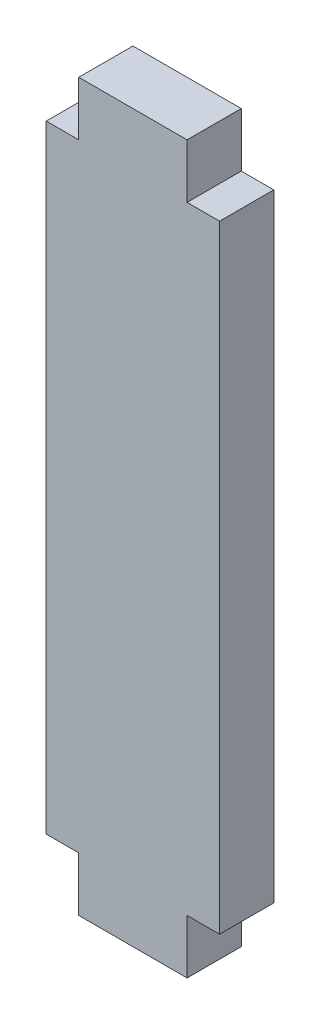
ISO-10303-21;
HEADER;
FILE_DESCRIPTION(('STEP AP214'),'2;1');
FILE_NAME('part.step','',(''),(''),'','','');
FILE_SCHEMA(('AUTOMOTIVE_DESIGN { 1 0 10303 214 1 1 1 1 }'));
ENDSEC;
DATA;
#1=APPLICATION_CONTEXT('core data for automotive mechanical design processes');
#2=APPLICATION_PROTOCOL_DEFINITION('international standard','automotive_design',2000,#1);
#3=PRODUCT_CONTEXT('',#1,'mechanical');
#4=PRODUCT('Part','Part','',(#3));
#5=PRODUCT_RELATED_PRODUCT_CATEGORY('part','',(#4));
#6=PRODUCT_DEFINITION_FORMATION('','',#4);
#7=PRODUCT_DEFINITION_CONTEXT('part definition',#1,'design');
#8=PRODUCT_DEFINITION('design','',#6,#7);
#9=PRODUCT_DEFINITION_SHAPE('','',#8);
#10=(LENGTH_UNIT() NAMED_UNIT(*) SI_UNIT(.MILLI.,.METRE.));
#11=(NAMED_UNIT(*) PLANE_ANGLE_UNIT() SI_UNIT($,.RADIAN.));
#12=(NAMED_UNIT(*) SI_UNIT($,.STERADIAN.) SOLID_ANGLE_UNIT());
#13=UNCERTAINTY_MEASURE_WITH_UNIT(LENGTH_MEASURE(1.E-05),#10,'distance_accuracy_value','');
#14=(GEOMETRIC_REPRESENTATION_CONTEXT(3) GLOBAL_UNCERTAINTY_ASSIGNED_CONTEXT((#13)) GLOBAL_UNIT_ASSIGNED_CONTEXT((#10,
#11,#12)) REPRESENTATION_CONTEXT('',''));
#15=CARTESIAN_POINT('',(0.,0.,0.));
#16=DIRECTION('',(0.,0.,1.));
#17=DIRECTION('',(1.,0.,0.));
#18=AXIS2_PLACEMENT_3D('',#15,#16,#17);
#19=CARTESIAN_POINT('',(5.00000000000001,28.5,5.));
#20=DIRECTION('',(-1.,0.,0.));
#21=DIRECTION('',(0.,-1.,0.));
#22=AXIS2_PLACEMENT_3D('',#19,#20,#21);
#23=PLANE('',#22);
#24=DIRECTION('',(0.,1.,0.));
#25=VECTOR('',#24,1.);
#26=CARTESIAN_POINT('',(5.00000000000001,28.5,0.));
#27=LINE('',#26,#25);
#28=CARTESIAN_POINT('',(5.00000000000001,28.5,0.));
#29=VERTEX_POINT('',#28);
#30=CARTESIAN_POINT('',(5.00000000000001,33.5,0.));
#31=VERTEX_POINT('',#30);
#32=EDGE_CURVE('E159',#29,#31,#27,.T.);
#33=ORIENTED_EDGE('',*,*,#32,.T.);
#34=DIRECTION('',(0.,0.,-1.));
#35=VECTOR('',#34,1.);
#36=CARTESIAN_POINT('',(5.00000000000001,33.5,5.));
#37=LINE('',#36,#35);
#38=CARTESIAN_POINT('',(5.00000000000001,33.5,5.));
#39=VERTEX_POINT('',#38);
#40=EDGE_CURVE('E11',#39,#31,#37,.T.);
#41=ORIENTED_EDGE('',*,*,#40,.F.);
#42=DIRECTION('',(0.,1.,0.));
#43=VECTOR('',#42,1.);
#44=CARTESIAN_POINT('',(5.00000000000001,28.5,5.));
#45=LINE('',#44,#43);
#46=CARTESIAN_POINT('',(5.00000000000001,28.5,5.));
#47=VERTEX_POINT('',#46);
#48=EDGE_CURVE('E181',#47,#39,#45,.T.);
#49=ORIENTED_EDGE('',*,*,#48,.F.);
#50=DIRECTION('',(0.,0.,-1.));
#51=VECTOR('',#50,1.);
#52=CARTESIAN_POINT('',(5.00000000000001,28.5,5.));
#53=LINE('',#52,#51);
#54=EDGE_CURVE('E155',#47,#29,#53,.T.);
#55=ORIENTED_EDGE('',*,*,#54,.T.);
#56=EDGE_LOOP('',(#33,#41,#49,#55));
#57=FACE_BOUND('',#56,.T.);
#58=ADVANCED_FACE('F39',(#57),#23,.F.);
#59=CARTESIAN_POINT('',(5.00000000000001,33.5,5.));
#60=DIRECTION('',(0.,-1.,0.));
#61=DIRECTION('',(0.,0.,-1.));
#62=AXIS2_PLACEMENT_3D('',#59,#60,#61);
#63=PLANE('',#62);
#64=DIRECTION('',(-1.,0.,0.));
#65=VECTOR('',#64,1.);
#66=CARTESIAN_POINT('',(5.00000000000001,33.5,0.));
#67=LINE('',#66,#65);
#68=CARTESIAN_POINT('',(-5.,33.5,0.));
#69=VERTEX_POINT('',#68);
#70=EDGE_CURVE('E162',#31,#69,#67,.T.);
#71=ORIENTED_EDGE('',*,*,#70,.T.);
#72=DIRECTION('',(0.,0.,-1.));
#73=VECTOR('',#72,1.);
#74=CARTESIAN_POINT('',(-5.,33.5,5.));
#75=LINE('',#74,#73);
#76=CARTESIAN_POINT('',(-5.,33.5,5.));
#77=VERTEX_POINT('',#76);
#78=EDGE_CURVE('E47',#77,#69,#75,.T.);
#79=ORIENTED_EDGE('',*,*,#78,.F.);
#80=DIRECTION('',(-1.,0.,0.));
#81=VECTOR('',#80,1.);
#82=CARTESIAN_POINT('',(5.00000000000001,33.5,5.));
#83=LINE('',#82,#81);
#84=EDGE_CURVE('E110',#39,#77,#83,.T.);
#85=ORIENTED_EDGE('',*,*,#84,.F.);
#86=ORIENTED_EDGE('',*,*,#40,.T.);
#87=EDGE_LOOP('',(#71,#79,#85,#86));
#88=FACE_BOUND('',#87,.T.);
#89=ADVANCED_FACE('F259',(#88),#63,.F.);
#90=CARTESIAN_POINT('',(-5.,33.5,5.));
#91=DIRECTION('',(1.,0.,0.));
#92=DIRECTION('',(0.,1.,0.));
#93=AXIS2_PLACEMENT_3D('',#90,#91,#92);
#94=PLANE('',#93);
#95=DIRECTION('',(0.,-1.,0.));
#96=VECTOR('',#95,1.);
#97=CARTESIAN_POINT('',(-5.,33.5,0.));
#98=LINE('',#97,#96);
#99=CARTESIAN_POINT('',(-5.,28.5,0.));
#100=VERTEX_POINT('',#99);
#101=EDGE_CURVE('E164',#69,#100,#98,.T.);
#102=ORIENTED_EDGE('',*,*,#101,.T.);
#103=DIRECTION('',(0.,0.,-1.));
#104=VECTOR('',#103,1.);
#105=CARTESIAN_POINT('',(-5.,28.5,5.));
#106=LINE('',#105,#104);
#107=CARTESIAN_POINT('',(-5.,28.5,5.));
#108=VERTEX_POINT('',#107);
#109=EDGE_CURVE('E200',#108,#100,#106,.T.);
#110=ORIENTED_EDGE('',*,*,#109,.F.);
#111=DIRECTION('',(0.,-1.,0.));
#112=VECTOR('',#111,1.);
#113=CARTESIAN_POINT('',(-5.,33.5,5.));
#114=LINE('',#113,#112);
#115=EDGE_CURVE('E208',#77,#108,#114,.T.);
#116=ORIENTED_EDGE('',*,*,#115,.F.);
#117=ORIENTED_EDGE('',*,*,#78,.T.);
#118=EDGE_LOOP('',(#102,#110,#116,#117));
#119=FACE_BOUND('',#118,.T.);
#120=ADVANCED_FACE('F206',(#119),#94,.F.);
#121=CARTESIAN_POINT('',(-5.,28.5,5.));
#122=DIRECTION('',(0.,-1.,0.));
#123=DIRECTION('',(1.,0.,0.));
#124=AXIS2_PLACEMENT_3D('',#121,#122,#123);
#125=PLANE('',#124);
#126=DIRECTION('',(-1.,0.,0.));
#127=VECTOR('',#126,1.);
#128=CARTESIAN_POINT('',(-5.,28.5,0.));
#129=LINE('',#128,#127);
#130=CARTESIAN_POINT('',(-8.,28.5,0.));
#131=VERTEX_POINT('',#130);
#132=EDGE_CURVE('E166',#100,#131,#129,.T.);
#133=ORIENTED_EDGE('',*,*,#132,.T.);
#134=DIRECTION('',(0.,0.,-1.));
#135=VECTOR('',#134,1.);
#136=CARTESIAN_POINT('',(-8.,28.5,5.));
#137=LINE('',#136,#135);
#138=CARTESIAN_POINT('',(-8.,28.5,5.));
#139=VERTEX_POINT('',#138);
#140=EDGE_CURVE('E197',#139,#131,#137,.T.);
#141=ORIENTED_EDGE('',*,*,#140,.F.);
#142=DIRECTION('',(-1.,0.,0.));
#143=VECTOR('',#142,1.);
#144=CARTESIAN_POINT('',(-5.,28.5,5.));
#145=LINE('',#144,#143);
#146=EDGE_CURVE('E226',#108,#139,#145,.T.);
#147=ORIENTED_EDGE('',*,*,#146,.F.);
#148=ORIENTED_EDGE('',*,*,#109,.T.);
#149=EDGE_LOOP('',(#133,#141,#147,#148));
#150=FACE_BOUND('',#149,.T.);
#151=ADVANCED_FACE('F217',(#150),#125,.F.);
#152=CARTESIAN_POINT('',(-8.,28.5,5.));
#153=DIRECTION('',(1.,0.,0.));
#154=DIRECTION('',(0.,1.,0.));
#155=AXIS2_PLACEMENT_3D('',#152,#153,#154);
#156=PLANE('',#155);
#157=DIRECTION('',(0.,-1.,0.));
#158=VECTOR('',#157,1.);
#159=CARTESIAN_POINT('',(-8.,28.5,0.));
#160=LINE('',#159,#158);
#161=CARTESIAN_POINT('',(-8.,-28.5,0.));
#162=VERTEX_POINT('',#161);
#163=EDGE_CURVE('E168',#131,#162,#160,.T.);
#164=ORIENTED_EDGE('',*,*,#163,.T.);
#165=DIRECTION('',(0.,0.,-1.));
#166=VECTOR('',#165,1.);
#167=CARTESIAN_POINT('',(-8.,-28.5,5.));
#168=LINE('',#167,#166);
#169=CARTESIAN_POINT('',(-8.,-28.5,5.));
#170=VERTEX_POINT('',#169);
#171=EDGE_CURVE('E194',#170,#162,#168,.T.);
#172=ORIENTED_EDGE('',*,*,#171,.F.);
#173=DIRECTION('',(0.,-1.,0.));
#174=VECTOR('',#173,1.);
#175=CARTESIAN_POINT('',(-8.,28.5,5.));
#176=LINE('',#175,#174);
#177=EDGE_CURVE('E223',#139,#170,#176,.T.);
#178=ORIENTED_EDGE('',*,*,#177,.F.);
#179=ORIENTED_EDGE('',*,*,#140,.T.);
#180=EDGE_LOOP('',(#164,#172,#178,#179));
#181=FACE_BOUND('',#180,.T.);
#182=ADVANCED_FACE('F221',(#181),#156,.F.);
#183=CARTESIAN_POINT('',(-8.,-28.5,5.));
#184=DIRECTION('',(0.,1.,0.));
#185=DIRECTION('',(-1.,0.,0.));
#186=AXIS2_PLACEMENT_3D('',#183,#184,#185);
#187=PLANE('',#186);
#188=DIRECTION('',(1.,0.,0.));
#189=VECTOR('',#188,1.);
#190=CARTESIAN_POINT('',(-8.,-28.5,0.));
#191=LINE('',#190,#189);
#192=CARTESIAN_POINT('',(-5.,-28.5,0.));
#193=VERTEX_POINT('',#192);
#194=EDGE_CURVE('E170',#162,#193,#191,.T.);
#195=ORIENTED_EDGE('',*,*,#194,.T.);
#196=DIRECTION('',(0.,0.,-1.));
#197=VECTOR('',#196,1.);
#198=CARTESIAN_POINT('',(-5.,-28.5,5.));
#199=LINE('',#198,#197);
#200=CARTESIAN_POINT('',(-5.,-28.5,5.));
#201=VERTEX_POINT('',#200);
#202=EDGE_CURVE('E191',#201,#193,#199,.T.);
#203=ORIENTED_EDGE('',*,*,#202,.F.);
#204=DIRECTION('',(1.,0.,0.));
#205=VECTOR('',#204,1.);
#206=CARTESIAN_POINT('',(-8.,-28.5,5.));
#207=LINE('',#206,#205);
#208=EDGE_CURVE('E225',#170,#201,#207,.T.);
#209=ORIENTED_EDGE('',*,*,#208,.F.);
#210=ORIENTED_EDGE('',*,*,#171,.T.);
#211=EDGE_LOOP('',(#195,#203,#209,#210));
#212=FACE_BOUND('',#211,.T.);
#213=ADVANCED_FACE('F272',(#212),#187,.F.);
#214=CARTESIAN_POINT('',(-5.,-33.5,5.));
#215=DIRECTION('',(1.,0.,0.));
#216=DIRECTION('',(0.,1.,0.));
#217=AXIS2_PLACEMENT_3D('',#214,#215,#216);
#218=PLANE('',#217);
#219=DIRECTION('',(0.,-1.,0.));
#220=VECTOR('',#219,1.);
#221=CARTESIAN_POINT('',(-5.,-33.5,0.));
#222=LINE('',#221,#220);
#223=CARTESIAN_POINT('',(-5.,-33.5,0.));
#224=VERTEX_POINT('',#223);
#225=EDGE_CURVE('E172',#193,#224,#222,.T.);
#226=ORIENTED_EDGE('',*,*,#225,.T.);
#227=DIRECTION('',(0.,0.,-1.));
#228=VECTOR('',#227,1.);
#229=CARTESIAN_POINT('',(-5.,-33.5,5.));
#230=LINE('',#229,#228);
#231=CARTESIAN_POINT('',(-5.,-33.5,5.));
#232=VERTEX_POINT('',#231);
#233=EDGE_CURVE('E188',#232,#224,#230,.T.);
#234=ORIENTED_EDGE('',*,*,#233,.F.);
#235=DIRECTION('',(0.,-1.,0.));
#236=VECTOR('',#235,1.);
#237=CARTESIAN_POINT('',(-5.,-33.5,5.));
#238=LINE('',#237,#236);
#239=EDGE_CURVE('E228',#201,#232,#238,.T.);
#240=ORIENTED_EDGE('',*,*,#239,.F.);
#241=ORIENTED_EDGE('',*,*,#202,.T.);
#242=EDGE_LOOP('',(#226,#234,#240,#241));
#243=FACE_BOUND('',#242,.T.);
#244=ADVANCED_FACE('F275',(#243),#218,.F.);
#245=CARTESIAN_POINT('',(5.00000000000001,-33.5,5.));
#246=DIRECTION('',(0.,1.,0.));
#247=DIRECTION('',(0.,0.,1.));
#248=AXIS2_PLACEMENT_3D('',#245,#246,#247);
#249=PLANE('',#248);
#250=DIRECTION('',(1.,0.,0.));
#251=VECTOR('',#250,1.);
#252=CARTESIAN_POINT('',(5.00000000000001,-33.5,0.));
#253=LINE('',#252,#251);
#254=CARTESIAN_POINT('',(5.00000000000001,-33.5,0.));
#255=VERTEX_POINT('',#254);
#256=EDGE_CURVE('E174',#224,#255,#253,.T.);
#257=ORIENTED_EDGE('',*,*,#256,.T.);
#258=DIRECTION('',(0.,0.,-1.));
#259=VECTOR('',#258,1.);
#260=CARTESIAN_POINT('',(5.00000000000001,-33.5,5.));
#261=LINE('',#260,#259);
#262=CARTESIAN_POINT('',(5.00000000000001,-33.5,5.));
#263=VERTEX_POINT('',#262);
#264=EDGE_CURVE('E185',#263,#255,#261,.T.);
#265=ORIENTED_EDGE('',*,*,#264,.F.);
#266=DIRECTION('',(1.,0.,0.));
#267=VECTOR('',#266,1.);
#268=CARTESIAN_POINT('',(5.00000000000001,-33.5,5.));
#269=LINE('',#268,#267);
#270=EDGE_CURVE('E234',#232,#263,#269,.T.);
#271=ORIENTED_EDGE('',*,*,#270,.F.);
#272=ORIENTED_EDGE('',*,*,#233,.T.);
#273=EDGE_LOOP('',(#257,#265,#271,#272));
#274=FACE_BOUND('',#273,.T.);
#275=ADVANCED_FACE('F240',(#274),#249,.F.);
#276=CARTESIAN_POINT('',(5.00000000000001,-28.5,5.));
#277=DIRECTION('',(-1.,0.,0.));
#278=DIRECTION('',(0.,-1.,0.));
#279=AXIS2_PLACEMENT_3D('',#276,#277,#278);
#280=PLANE('',#279);
#281=DIRECTION('',(0.,1.,0.));
#282=VECTOR('',#281,1.);
#283=CARTESIAN_POINT('',(5.00000000000001,-28.5,0.));
#284=LINE('',#283,#282);
#285=CARTESIAN_POINT('',(5.00000000000001,-28.5,0.));
#286=VERTEX_POINT('',#285);
#287=EDGE_CURVE('E176',#255,#286,#284,.T.);
#288=ORIENTED_EDGE('',*,*,#287,.T.);
#289=DIRECTION('',(0.,0.,-1.));
#290=VECTOR('',#289,1.);
#291=CARTESIAN_POINT('',(5.00000000000001,-28.5,5.));
#292=LINE('',#291,#290);
#293=CARTESIAN_POINT('',(5.00000000000001,-28.5,5.));
#294=VERTEX_POINT('',#293);
#295=EDGE_CURVE('E150',#294,#286,#292,.T.);
#296=ORIENTED_EDGE('',*,*,#295,.F.);
#297=DIRECTION('',(0.,1.,0.));
#298=VECTOR('',#297,1.);
#299=CARTESIAN_POINT('',(5.00000000000001,-28.5,5.));
#300=LINE('',#299,#298);
#301=EDGE_CURVE('E141',#263,#294,#300,.T.);
#302=ORIENTED_EDGE('',*,*,#301,.F.);
#303=ORIENTED_EDGE('',*,*,#264,.T.);
#304=EDGE_LOOP('',(#288,#296,#302,#303));
#305=FACE_BOUND('',#304,.T.);
#306=ADVANCED_FACE('F244',(#305),#280,.F.);
#307=CARTESIAN_POINT('',(5.00000000000001,-28.5,5.));
#308=DIRECTION('',(0.,1.,0.));
#309=DIRECTION('',(-1.,0.,0.));
#310=AXIS2_PLACEMENT_3D('',#307,#308,#309);
#311=PLANE('',#310);
#312=DIRECTION('',(1.,0.,0.));
#313=VECTOR('',#312,1.);
#314=CARTESIAN_POINT('',(5.00000000000001,-28.5,0.));
#315=LINE('',#314,#313);
#316=CARTESIAN_POINT('',(8.,-28.5,0.));
#317=VERTEX_POINT('',#316);
#318=EDGE_CURVE('E149',#286,#317,#315,.T.);
#319=ORIENTED_EDGE('',*,*,#318,.T.);
#320=DIRECTION('',(0.,0.,-1.));
#321=VECTOR('',#320,1.);
#322=CARTESIAN_POINT('',(8.,-28.5,5.));
#323=LINE('',#322,#321);
#324=CARTESIAN_POINT('',(8.,-28.5,5.));
#325=VERTEX_POINT('',#324);
#326=EDGE_CURVE('E146',#325,#317,#323,.T.);
#327=ORIENTED_EDGE('',*,*,#326,.F.);
#328=DIRECTION('',(1.,0.,0.));
#329=VECTOR('',#328,1.);
#330=CARTESIAN_POINT('',(5.00000000000001,-28.5,5.));
#331=LINE('',#330,#329);
#332=EDGE_CURVE('E135',#294,#325,#331,.T.);
#333=ORIENTED_EDGE('',*,*,#332,.F.);
#334=ORIENTED_EDGE('',*,*,#295,.T.);
#335=EDGE_LOOP('',(#319,#327,#333,#334));
#336=FACE_BOUND('',#335,.T.);
#337=ADVANCED_FACE('F147',(#336),#311,.F.);
#338=CARTESIAN_POINT('',(8.,-28.5,5.));
#339=DIRECTION('',(-1.,0.,0.));
#340=DIRECTION('',(0.,-1.,0.));
#341=AXIS2_PLACEMENT_3D('',#338,#339,#340);
#342=PLANE('',#341);
#343=DIRECTION('',(0.,1.,0.));
#344=VECTOR('',#343,1.);
#345=CARTESIAN_POINT('',(8.,-28.5,0.));
#346=LINE('',#345,#344);
#347=CARTESIAN_POINT('',(8.,28.5,0.));
#348=VERTEX_POINT('',#347);
#349=EDGE_CURVE('E96',#317,#348,#346,.T.);
#350=ORIENTED_EDGE('',*,*,#349,.T.);
#351=DIRECTION('',(0.,0.,-1.));
#352=VECTOR('',#351,1.);
#353=CARTESIAN_POINT('',(8.,28.5,5.));
#354=LINE('',#353,#352);
#355=CARTESIAN_POINT('',(8.,28.5,5.));
#356=VERTEX_POINT('',#355);
#357=EDGE_CURVE('E151',#356,#348,#354,.T.);
#358=ORIENTED_EDGE('',*,*,#357,.F.);
#359=DIRECTION('',(0.,1.,0.));
#360=VECTOR('',#359,1.);
#361=CARTESIAN_POINT('',(8.,-28.5,5.));
#362=LINE('',#361,#360);
#363=EDGE_CURVE('E139',#325,#356,#362,.T.);
#364=ORIENTED_EDGE('',*,*,#363,.F.);
#365=ORIENTED_EDGE('',*,*,#326,.T.);
#366=EDGE_LOOP('',(#350,#358,#364,#365));
#367=FACE_BOUND('',#366,.T.);
#368=ADVANCED_FACE('F153',(#367),#342,.F.);
#369=CARTESIAN_POINT('',(8.,28.5,5.));
#370=DIRECTION('',(0.,-1.,0.));
#371=DIRECTION('',(1.,0.,0.));
#372=AXIS2_PLACEMENT_3D('',#369,#370,#371);
#373=PLANE('',#372);
#374=DIRECTION('',(-1.,0.,0.));
#375=VECTOR('',#374,1.);
#376=CARTESIAN_POINT('',(8.,28.5,0.));
#377=LINE('',#376,#375);
#378=EDGE_CURVE('E102',#348,#29,#377,.T.);
#379=ORIENTED_EDGE('',*,*,#378,.T.);
#380=ORIENTED_EDGE('',*,*,#54,.F.);
#381=DIRECTION('',(-1.,0.,0.));
#382=VECTOR('',#381,1.);
#383=CARTESIAN_POINT('',(8.,28.5,5.));
#384=LINE('',#383,#382);
#385=EDGE_CURVE('E55',#356,#47,#384,.T.);
#386=ORIENTED_EDGE('',*,*,#385,.F.);
#387=ORIENTED_EDGE('',*,*,#357,.T.);
#388=EDGE_LOOP('',(#379,#380,#386,#387));
#389=FACE_BOUND('',#388,.T.);
#390=ADVANCED_FACE('F248',(#389),#373,.F.);
#391=CARTESIAN_POINT('',(0.,0.,5.));
#392=DIRECTION('',(0.,0.,1.));
#393=DIRECTION('',(1.,0.,0.));
#394=AXIS2_PLACEMENT_3D('',#391,#392,#393);
#395=PLANE('',#394);
#396=ORIENTED_EDGE('',*,*,#48,.T.);
#397=ORIENTED_EDGE('',*,*,#84,.T.);
#398=ORIENTED_EDGE('',*,*,#115,.T.);
#399=ORIENTED_EDGE('',*,*,#146,.T.);
#400=ORIENTED_EDGE('',*,*,#177,.T.);
#401=ORIENTED_EDGE('',*,*,#208,.T.);
#402=ORIENTED_EDGE('',*,*,#239,.T.);
#403=ORIENTED_EDGE('',*,*,#270,.T.);
#404=ORIENTED_EDGE('',*,*,#301,.T.);
#405=ORIENTED_EDGE('',*,*,#332,.T.);
#406=ORIENTED_EDGE('',*,*,#363,.T.);
#407=ORIENTED_EDGE('',*,*,#385,.T.);
#408=EDGE_LOOP('',(#396,#397,#398,#399,#400,#401,#402,#403,#404,#405,#406,#407));
#409=FACE_BOUND('',#408,.T.);
#410=ADVANCED_FACE('F137',(#409),#395,.T.);
#411=CARTESIAN_POINT('',(0.,0.,0.));
#412=DIRECTION('',(0.,0.,1.));
#413=DIRECTION('',(1.,0.,0.));
#414=AXIS2_PLACEMENT_3D('',#411,#412,#413);
#415=PLANE('',#414);
#416=ORIENTED_EDGE('',*,*,#32,.F.);
#417=ORIENTED_EDGE('',*,*,#378,.F.);
#418=ORIENTED_EDGE('',*,*,#349,.F.);
#419=ORIENTED_EDGE('',*,*,#318,.F.);
#420=ORIENTED_EDGE('',*,*,#287,.F.);
#421=ORIENTED_EDGE('',*,*,#256,.F.);
#422=ORIENTED_EDGE('',*,*,#225,.F.);
#423=ORIENTED_EDGE('',*,*,#194,.F.);
#424=ORIENTED_EDGE('',*,*,#163,.F.);
#425=ORIENTED_EDGE('',*,*,#132,.F.);
#426=ORIENTED_EDGE('',*,*,#101,.F.);
#427=ORIENTED_EDGE('',*,*,#70,.F.);
#428=EDGE_LOOP('',(#416,#417,#418,#419,#420,#421,#422,#423,#424,#425,#426,#427));
#429=FACE_BOUND('',#428,.T.);
#430=ADVANCED_FACE('F212',(#429),#415,.F.);
#431=CLOSED_SHELL('',(#58,#89,#120,#151,#182,#213,#244,#275,#306,#337,#368,#390,#410,#430));
#432=MANIFOLD_SOLID_BREP('B2',#431);
#433=ADVANCED_BREP_SHAPE_REPRESENTATION('',(#18,#432),#14);
#434=SHAPE_DEFINITION_REPRESENTATION(#9,#433);
ENDSEC;
END-ISO-10303-21;
